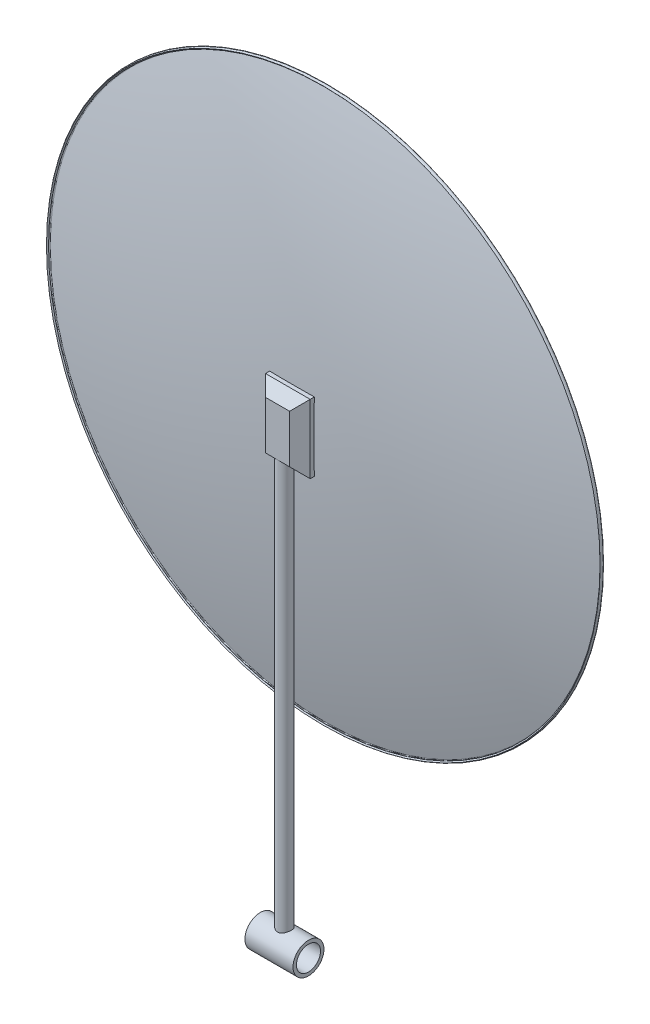
ISO-10303-21;
HEADER;
FILE_DESCRIPTION(('STEP AP214'),'2;1');
FILE_NAME('part.step','',(''),(''),'','','');
FILE_SCHEMA(('AUTOMOTIVE_DESIGN { 1 0 10303 214 1 1 1 1 }'));
ENDSEC;
DATA;
#1=APPLICATION_CONTEXT('core data for automotive mechanical design processes');
#2=APPLICATION_PROTOCOL_DEFINITION('international standard','automotive_design',2000,#1);
#3=PRODUCT_CONTEXT('',#1,'mechanical');
#4=PRODUCT('Part','Part','',(#3));
#5=PRODUCT_RELATED_PRODUCT_CATEGORY('part','',(#4));
#6=PRODUCT_DEFINITION_FORMATION('','',#4);
#7=PRODUCT_DEFINITION_CONTEXT('part definition',#1,'design');
#8=PRODUCT_DEFINITION('design','',#6,#7);
#9=PRODUCT_DEFINITION_SHAPE('','',#8);
#10=(LENGTH_UNIT() NAMED_UNIT(*) SI_UNIT(.MILLI.,.METRE.));
#11=(NAMED_UNIT(*) PLANE_ANGLE_UNIT() SI_UNIT($,.RADIAN.));
#12=(NAMED_UNIT(*) SI_UNIT($,.STERADIAN.) SOLID_ANGLE_UNIT());
#13=UNCERTAINTY_MEASURE_WITH_UNIT(LENGTH_MEASURE(1.E-05),#10,'distance_accuracy_value','');
#14=(GEOMETRIC_REPRESENTATION_CONTEXT(3) GLOBAL_UNCERTAINTY_ASSIGNED_CONTEXT((#13)) GLOBAL_UNIT_ASSIGNED_CONTEXT((#10,
#11,#12)) REPRESENTATION_CONTEXT('',''));
#15=CARTESIAN_POINT('',(0.,0.,0.));
#16=DIRECTION('',(0.,0.,1.));
#17=DIRECTION('',(1.,0.,0.));
#18=AXIS2_PLACEMENT_3D('',#15,#16,#17);
#19=CARTESIAN_POINT('',(35.,-650.,1637.));
#20=DIRECTION('',(-1.,0.,0.));
#21=DIRECTION('',(0.,0.,1.));
#22=AXIS2_PLACEMENT_3D('',#19,#20,#21);
#23=CYLINDRICAL_SURFACE('',#22,22.4999999999999);
#24=CARTESIAN_POINT('',(35.,-650.,1637.));
#25=DIRECTION('',(1.,0.,0.));
#26=DIRECTION('',(0.,0.,-1.));
#27=AXIS2_PLACEMENT_3D('',#24,#25,#26);
#28=CIRCLE('',#27,22.4999999999999);
#29=CARTESIAN_POINT('',(35.,-650.,1614.5));
#30=VERTEX_POINT('',#29);
#31=EDGE_CURVE('E12',#30,#30,#28,.T.);
#32=ORIENTED_EDGE('',*,*,#31,.F.);
#33=EDGE_LOOP('',(#32));
#34=FACE_BOUND('',#33,.T.);
#35=CARTESIAN_POINT('',(-35.,-650.,1637.));
#36=DIRECTION('',(1.,0.,0.));
#37=DIRECTION('',(0.,0.,-1.));
#38=AXIS2_PLACEMENT_3D('',#35,#36,#37);
#39=CIRCLE('',#38,22.4999999999999);
#40=CARTESIAN_POINT('',(-35.,-650.,1614.5));
#41=VERTEX_POINT('',#40);
#42=EDGE_CURVE('E46',#41,#41,#39,.T.);
#43=ORIENTED_EDGE('',*,*,#42,.T.);
#44=EDGE_LOOP('',(#43));
#45=FACE_BOUND('',#44,.T.);
#46=CARTESIAN_POINT('',(0.,-629.844355629254,1647.));
#47=CARTESIAN_POINT('',(-0.264893222766786,-629.844353266186,1646.99999788988));
#48=CARTESIAN_POINT('',(-0.529858910632883,-629.839115518338,1646.98945970578));
#49=CARTESIAN_POINT('',(-1.05782912167855,-629.818341760167,1646.94742186521));
#50=CARTESIAN_POINT('',(-1.32083238360988,-629.802799621743,1646.91590973534));
#51=CARTESIAN_POINT('',(-1.84329075499647,-629.761922773234,1646.83221232719));
#52=CARTESIAN_POINT('',(-2.10273785965919,-629.736568844321,1646.77998647092));
#53=CARTESIAN_POINT('',(-2.61580692820177,-629.676922745833,1646.655427986));
#54=CARTESIAN_POINT('',(-2.86942636769449,-629.642626779371,1646.58308681529));
#55=CARTESIAN_POINT('',(-3.36787435976666,-629.566394820367,1646.41944147543));
#56=CARTESIAN_POINT('',(-3.612740061546,-629.524497294152,1646.32823247179));
#57=CARTESIAN_POINT('',(-4.09362299113539,-629.434206046952,1646.1274433097));
#58=CARTESIAN_POINT('',(-4.32963678705899,-629.385809839061,1646.01785611429));
#59=CARTESIAN_POINT('',(-5.02217407233228,-629.232961068371,1645.66293925994));
#60=CARTESIAN_POINT('',(-5.46377159491158,-629.120754777156,1645.39126272339));
#61=CARTESIAN_POINT('',(-6.32515552311294,-628.879506304949,1644.76492214778));
#62=CARTESIAN_POINT('',(-6.74169992663891,-628.749845074449,1644.40603685697));
#63=CARTESIAN_POINT('',(-7.31849445200715,-628.557577028544,1643.8201900345));
#64=CARTESIAN_POINT('',(-7.50286899205392,-628.493814001776,1643.61682725277));
#65=CARTESIAN_POINT('',(-7.85457108124226,-628.368604174401,1643.19523871841));
#66=CARTESIAN_POINT('',(-8.02190489388817,-628.30715652802,1642.97701847636));
#67=CARTESIAN_POINT('',(-8.34655823456868,-628.185067983142,1642.51531001918));
#68=CARTESIAN_POINT('',(-8.50292843309705,-628.124628933583,1642.2711003579));
#69=CARTESIAN_POINT('',(-8.79433392314293,-628.009720666334,1641.76905477068));
#70=CARTESIAN_POINT('',(-8.92937808288005,-627.955248970082,1641.51122456854));
#71=CARTESIAN_POINT('',(-9.17692789686615,-627.853820780864,1640.98357877187));
#72=CARTESIAN_POINT('',(-9.28943715157123,-627.80686308761,1640.7137651004));
#73=CARTESIAN_POINT('',(-9.4907465385539,-627.721850676925,1640.164076172));
#74=CARTESIAN_POINT('',(-9.57954859082745,-627.683795238551,1639.88420173196));
#75=CARTESIAN_POINT('',(-9.72795131986179,-627.61967764754,1639.33314810454));
#76=CARTESIAN_POINT('',(-9.78895139332305,-627.593046119747,1639.0624117047));
#77=CARTESIAN_POINT('',(-9.88831107821199,-627.549461101742,1638.51604349653));
#78=CARTESIAN_POINT('',(-9.92667149487341,-627.532507267321,1638.24041186267));
#79=CARTESIAN_POINT('',(-9.98027933035644,-627.508770651393,1637.68658291075));
#80=CARTESIAN_POINT('',(-9.99553586948376,-627.501983856437,1637.40838664874));
#81=CARTESIAN_POINT('',(-10.0027737496438,-627.49876739847,1636.85163715474));
#82=CARTESIAN_POINT('',(-9.9947561458381,-627.502337265926,1636.57308393949));
#83=CARTESIAN_POINT('',(-9.95690917298989,-627.519124010819,1636.03716099116));
#84=CARTESIAN_POINT('',(-9.92862689765551,-627.531656518492,1635.77965874179));
#85=CARTESIAN_POINT('',(-9.85229236815466,-627.565283819603,1635.26818391145));
#86=CARTESIAN_POINT('',(-9.8042412071589,-627.586378139594,1635.0142111361));
#87=CARTESIAN_POINT('',(-9.68885278767565,-627.636610866924,1634.51149713066));
#88=CARTESIAN_POINT('',(-9.62151488194365,-627.665749544222,1634.26275607644));
#89=CARTESIAN_POINT('',(-9.46819259099748,-627.731370151891,1633.77208939092));
#90=CARTESIAN_POINT('',(-9.38220761059892,-627.767852316653,1633.53016397743));
#91=CARTESIAN_POINT('',(-9.19090546292428,-627.847910307968,1633.05097592972));
#92=CARTESIAN_POINT('',(-9.08531760941256,-627.891584348886,1632.81383770601));
#93=CARTESIAN_POINT('',(-8.85654234714597,-627.984608712838,1632.34932681145));
#94=CARTESIAN_POINT('',(-8.73334864963748,-628.033961062912,1632.12195766799));
#95=CARTESIAN_POINT('',(-8.33871167083957,-628.188871893507,1631.4563830872));
#96=CARTESIAN_POINT('',(-8.04209401987536,-628.301335469466,1631.03441591738));
#97=CARTESIAN_POINT('',(-7.36331076527228,-628.543989733526,1630.2111677291));
#98=CARTESIAN_POINT('',(-6.97625386257726,-628.67487897682,1629.81411891682));
#99=CARTESIAN_POINT('',(-6.35043917480369,-628.868537755327,1629.27028107768));
#100=CARTESIAN_POINT('',(-6.13414522209932,-628.932684476566,1629.09753169129));
#101=CARTESIAN_POINT('',(-5.68740074980601,-629.058400408055,1628.77016993501));
#102=CARTESIAN_POINT('',(-5.45694839985252,-629.11996928331,1628.61555991768));
#103=CARTESIAN_POINT('',(-4.97321313772538,-629.241248578339,1628.31950914949));
#104=CARTESIAN_POINT('',(-4.71937792604156,-629.300772469234,1628.17889374224));
#105=CARTESIAN_POINT('',(-4.19934554269097,-629.413108455593,1627.91981100518));
#106=CARTESIAN_POINT('',(-3.93315389547572,-629.465923511796,1627.80133389435));
#107=CARTESIAN_POINT('',(-3.39018441382009,-629.562973452533,1627.58768235873));
#108=CARTESIAN_POINT('',(-3.11341126085276,-629.607212080045,1627.49249776368));
#109=CARTESIAN_POINT('',(-2.55124522545489,-629.685438053987,1627.32647862188));
#110=CARTESIAN_POINT('',(-2.26585324435957,-629.719426468302,1627.25564153844));
#111=CARTESIAN_POINT('',(-1.70924022896528,-629.773772152647,1627.1433619682));
#112=CARTESIAN_POINT('',(-1.43844393322784,-629.794923286029,1627.10019529117));
#113=CARTESIAN_POINT('',(-0.893595718751954,-629.826389155497,1627.03623023032));
#114=CARTESIAN_POINT('',(-0.619543957450853,-629.836704413477,1627.01543076923));
#115=CARTESIAN_POINT('',(-0.0705692971284981,-629.846100045461,1626.99647918436));
#116=CARTESIAN_POINT('',(0.20435323751035,-629.845184622411,1626.99831858827));
#117=CARTESIAN_POINT('',(0.752841118051578,-629.832163913954,1627.02460006919));
#118=CARTESIAN_POINT('',(1.02640651702027,-629.820059069595,1627.04904125531));
#119=CARTESIAN_POINT('',(1.54882312722352,-629.786483878642,1627.11743558923));
#120=CARTESIAN_POINT('',(1.79794574261846,-629.765812598722,1627.15972865015));
#121=CARTESIAN_POINT('',(2.29154968826363,-629.7159942914,1627.26283466557));
#122=CARTESIAN_POINT('',(2.53602940762284,-629.6868443775,1627.32365392751));
#123=CARTESIAN_POINT('',(3.01871006088106,-629.620955748726,1627.4632029294));
#124=CARTESIAN_POINT('',(3.25691215759689,-629.584218450578,1627.54192932598));
#125=CARTESIAN_POINT('',(3.72585488903864,-629.504181292102,1627.71664691841));
#126=CARTESIAN_POINT('',(3.95659255086323,-629.460878855153,1627.81264489562));
#127=CARTESIAN_POINT('',(4.41939143687032,-629.366836647405,1628.02577438489));
#128=CARTESIAN_POINT('',(4.65105838996593,-629.315852367397,1628.14365377332));
#129=CARTESIAN_POINT('',(5.10383339590104,-629.209361150522,1628.39661867253));
#130=CARTESIAN_POINT('',(5.32493678040734,-629.153852242892,1628.53171169553));
#131=CARTESIAN_POINT('',(5.75549590915846,-629.039736901942,1628.81824291672));
#132=CARTESIAN_POINT('',(5.96494955534928,-628.981129914358,1628.96968404476));
#133=CARTESIAN_POINT('',(6.37123083359805,-628.862241347212,1629.28805902009));
#134=CARTESIAN_POINT('',(6.56805780235373,-628.801959679913,1629.45499368016));
#135=CARTESIAN_POINT('',(6.96630868570404,-628.675354841734,1629.82014549249));
#136=CARTESIAN_POINT('',(7.16638306915841,-628.609003402374,1630.01982775033));
#137=CARTESIAN_POINT('',(7.54906771567498,-628.477776119518,1630.43559738717));
#138=CARTESIAN_POINT('',(7.73168365067527,-628.412899802038,1630.65167939698));
#139=CARTESIAN_POINT('',(8.07845764824557,-628.286285333699,1631.09926218497));
#140=CARTESIAN_POINT('',(8.24260510455657,-628.224548997137,1631.33077170272));
#141=CARTESIAN_POINT('',(8.55105645817766,-628.105929953454,1631.80769381382));
#142=CARTESIAN_POINT('',(8.69536894743247,-628.049045148866,1632.05310032192));
#143=CARTESIAN_POINT('',(8.96422211083728,-627.94117008607,1632.5586703516));
#144=CARTESIAN_POINT('',(9.08857626936115,-627.890236521722,1632.81894536014));
#145=CARTESIAN_POINT('',(9.31475432231985,-627.79630528704,1633.35051039741));
#146=CARTESIAN_POINT('',(9.41657782680626,-627.753307754062,1633.62180061669));
#147=CARTESIAN_POINT('',(9.59653508100621,-627.676540096851,1634.17323865695));
#148=CARTESIAN_POINT('',(9.67468215003361,-627.642764785665,1634.45338139957));
#149=CARTESIAN_POINT('',(9.80642089323772,-627.585443025676,1635.02040338006));
#150=CARTESIAN_POINT('',(9.86001473466411,-627.561895674087,1635.30728202102));
#151=CARTESIAN_POINT('',(9.93878279058353,-627.527166088272,1635.86285450006));
#152=CARTESIAN_POINT('',(9.96583978011225,-627.515166056237,1636.13123177944));
#153=CARTESIAN_POINT('',(9.99817456596777,-627.50081601727,1636.66954714388));
#154=CARTESIAN_POINT('',(10.0034535482587,-627.498465484855,1636.93948514316));
#155=CARTESIAN_POINT('',(9.99217279985496,-627.503478189862,1637.47875754678));
#156=CARTESIAN_POINT('',(9.97561733071397,-627.510839531762,1637.74809205864));
#157=CARTESIAN_POINT('',(9.92086803636466,-627.535071333183,1638.28411610926));
#158=CARTESIAN_POINT('',(9.88267446227063,-627.55194168235,1638.55080567868));
#159=CARTESIAN_POINT('',(9.78726399042329,-627.593777874414,1639.06771118811));
#160=CARTESIAN_POINT('',(9.73097274942942,-627.618348568282,1639.3181309575));
#161=CARTESIAN_POINT('',(9.59956436386007,-627.675167952371,1639.81317832182));
#162=CARTESIAN_POINT('',(9.52444067518681,-627.707419311355,1640.05780387091));
#163=CARTESIAN_POINT('',(9.35607851748666,-627.778829948085,1640.53961949148));
#164=CARTESIAN_POINT('',(9.26284462261198,-627.817987481288,1640.77681142295));
#165=CARTESIAN_POINT('',(9.05898188158795,-627.902340812026,1641.24258216784));
#166=CARTESIAN_POINT('',(8.9483463993154,-627.94753891215,1641.47115765397));
#167=CARTESIAN_POINT('',(8.70511554092625,-628.045135630289,1641.92859841085));
#168=CARTESIAN_POINT('',(8.57175050921727,-628.097768176771,1642.15700447949));
#169=CARTESIAN_POINT('',(8.28784609439086,-628.207312237103,1642.6018989208));
#170=CARTESIAN_POINT('',(8.13730081312718,-628.264225218167,1642.81838316254));
#171=CARTESIAN_POINT('',(7.8200011252835,-628.381011661907,1643.23833757112));
#172=CARTESIAN_POINT('',(7.65324375035968,-628.44088566574,1643.44180534337));
#173=CARTESIAN_POINT('',(7.30448442404323,-628.562211746507,1643.834729139));
#174=CARTESIAN_POINT('',(7.12248166711394,-628.623663906709,1644.024184421));
#175=CARTESIAN_POINT('',(6.72920276426877,-628.751590202538,1644.40257086716));
#176=CARTESIAN_POINT('',(6.51674987514806,-628.818077323461,1644.59027675571));
#177=CARTESIAN_POINT('',(6.07643847757876,-628.949371334233,1644.94714925759));
#178=CARTESIAN_POINT('',(5.84858484088822,-629.014178746536,1645.1163216897));
#179=CARTESIAN_POINT('',(5.37838830215551,-629.140332536944,1645.43526657623));
#180=CARTESIAN_POINT('',(5.13603019128479,-629.201675146237,1645.5850181267));
#181=CARTESIAN_POINT('',(4.63851074083987,-629.318912485554,1645.86371677266));
#182=CARTESIAN_POINT('',(4.383355244408,-629.374809668207,1645.99267325159));
#183=CARTESIAN_POINT('',(3.86051776752749,-629.479577672107,1646.22925198455));
#184=CARTESIAN_POINT('',(3.59278525608953,-629.52841623584,1646.33677709633));
#185=CARTESIAN_POINT('',(3.04779572018049,-629.61699631455,1646.5286061316));
#186=CARTESIAN_POINT('',(2.7705435449444,-629.656742384362,1646.6129216861));
#187=CARTESIAN_POINT('',(2.20926578372365,-629.72554595679,1646.75719704322));
#188=CARTESIAN_POINT('',(1.92526008754448,-629.754631496429,1646.81722077692));
#189=CARTESIAN_POINT('',(1.35231205774493,-629.801055194436,1646.91238948186));
#190=CARTESIAN_POINT('',(1.06337360113138,-629.818402179223,1646.94755314669));
#191=CARTESIAN_POINT('',(0.644739380036075,-629.834457097055,1646.98002857488));
#192=CARTESIAN_POINT('',(0.515942344745803,-629.838165289659,1646.98751472603));
#193=CARTESIAN_POINT('',(0.25810261127328,-629.843115165208,1646.99750102093));
#194=CARTESIAN_POINT('',(0.129059906457335,-629.844356780575,1647.00000102808));
#195=CARTESIAN_POINT('',(0.,-629.844355629254,1647.));
#196=B_SPLINE_CURVE_WITH_KNOTS('',3,(#46,#47,#48,#49,#50,#51,#52,#53,#54,#55,#56,#57,#58,#59,
#60,#61,#62,#63,#64,#65,#66,#67,#68,#69,#70,#71,#72,#73,#74,#75,#76,#77,#78,#79,#80,#81,#82,#83,
#84,#85,#86,#87,#88,#89,#90,#91,#92,#93,#94,#95,#96,#97,#98,#99,#100,#101,#102,#103,#104,#105,
#106,#107,#108,#109,#110,#111,#112,#113,#114,#115,#116,#117,#118,#119,#120,#121,#122,#123,#124,
#125,#126,#127,#128,#129,#130,#131,#132,#133,#134,#135,#136,#137,#138,#139,#140,#141,#142,#143,
#144,#145,#146,#147,#148,#149,#150,#151,#152,#153,#154,#155,#156,#157,#158,#159,#160,#161,#162,
#163,#164,#165,#166,#167,#168,#169,#170,#171,#172,#173,#174,#175,#176,#177,#178,#179,#180,#181,
#182,#183,#184,#185,#186,#187,#188,#189,#190,#191,#192,#193,#194,#195),.UNSPECIFIED.,.T.,.F.,(4,
2,2,2,2,2,2,2,2,2,2,2,2,2,2,2,2,2,2,2,2,2,2,2,2,2,2,2,2,2,2,2,2,2,2,2,2,2,2,2,2,2,2,2,2,2,2,2,2,
2,2,2,2,2,2,2,2,2,2,2,2,2,2,2,2,2,2,2,2,2,2,2,2,2,4),(0.,0.794545983661118,1.58956491441366,
2.3861490339793,3.18307194418872,3.97606927706702,4.76937094238583,6.35414685016731,
8.04110114663061,8.88577403161513,9.73013531874925,10.6176638867953,11.5048224075619,
12.3918390716066,13.2787838762478,14.1140769634438,14.9493403396453,15.7842739077912,
16.6191696238023,17.3963151015549,18.1734176108505,18.950546202011,19.727699601508,
20.5165126239904,21.3056081156,22.8828449625339,24.5840413585069,25.4357153849808,
26.287499746514,27.1750428438785,28.0621928803459,28.9489548653083,29.835624433903,
30.6596032289087,31.4835423364615,32.3071731042589,33.1307714087573,33.8905016124848,
34.6504907649216,35.410338139231,36.1704845067569,36.9643087194597,37.7584805601152,
38.552794966708,39.3471510659659,40.2172097801,41.0869848602163,41.9572569208193,
42.8271508081116,43.7047523008649,44.5823689814845,45.4594910331811,46.3365356486664,
47.1455154397357,47.9544511756426,48.7632290503415,49.5719975392128,50.3446501244675,
51.1175715722755,51.890298054108,52.6633199340977,53.4714833490809,54.279925053828,
55.0885150595095,55.8971478165153,56.7697018395638,57.6419811256008,58.5151916438938,
59.3880070306049,60.2646929065415,61.140938645009,62.0148630483927,62.8881296009236,
63.2752335817625,63.6623481679957),.UNSPECIFIED.);
#197=CARTESIAN_POINT('',(0.,-629.844355629254,1647.));
#198=VERTEX_POINT('',#197);
#199=EDGE_CURVE('E125',#198,#198,#196,.T.);
#200=ORIENTED_EDGE('',*,*,#199,.T.);
#201=EDGE_LOOP('',(#200));
#202=FACE_BOUND('',#201,.T.);
#203=ADVANCED_FACE('F43',(#34,#45,#202),#23,.T.);
#204=CARTESIAN_POINT('',(35.,-650.,1637.));
#205=DIRECTION('',(1.,0.,0.));
#206=DIRECTION('',(0.,0.,-1.));
#207=AXIS2_PLACEMENT_3D('',#204,#205,#206);
#208=PLANE('',#207);
#209=ORIENTED_EDGE('',*,*,#31,.T.);
#210=EDGE_LOOP('',(#209));
#211=FACE_BOUND('',#210,.T.);
#212=CARTESIAN_POINT('',(35.,-650.,1637.));
#213=DIRECTION('',(1.,0.,0.));
#214=DIRECTION('',(0.,0.,-1.));
#215=AXIS2_PLACEMENT_3D('',#212,#213,#214);
#216=CIRCLE('',#215,17.5);
#217=CARTESIAN_POINT('',(35.,-650.,1619.5));
#218=VERTEX_POINT('',#217);
#219=EDGE_CURVE('E143',#218,#218,#216,.T.);
#220=ORIENTED_EDGE('',*,*,#219,.F.);
#221=EDGE_LOOP('',(#220));
#222=FACE_BOUND('',#221,.T.);
#223=ADVANCED_FACE('F214',(#211,#222),#208,.T.);
#224=CARTESIAN_POINT('',(-35.,-650.,1637.));
#225=DIRECTION('',(1.,0.,0.));
#226=DIRECTION('',(0.,0.,-1.));
#227=AXIS2_PLACEMENT_3D('',#224,#225,#226);
#228=PLANE('',#227);
#229=ORIENTED_EDGE('',*,*,#42,.F.);
#230=EDGE_LOOP('',(#229));
#231=FACE_BOUND('',#230,.T.);
#232=CARTESIAN_POINT('',(-35.,-650.,1637.));
#233=DIRECTION('',(1.,0.,0.));
#234=DIRECTION('',(0.,0.,-1.));
#235=AXIS2_PLACEMENT_3D('',#232,#233,#234);
#236=CIRCLE('',#235,17.5);
#237=CARTESIAN_POINT('',(-35.,-650.,1619.5));
#238=VERTEX_POINT('',#237);
#239=EDGE_CURVE('E142',#238,#238,#236,.T.);
#240=ORIENTED_EDGE('',*,*,#239,.T.);
#241=EDGE_LOOP('',(#240));
#242=FACE_BOUND('',#241,.T.);
#243=ADVANCED_FACE('F219',(#231,#242),#228,.F.);
#244=CARTESIAN_POINT('',(35.,-650.,1637.));
#245=DIRECTION('',(-1.,0.,0.));
#246=DIRECTION('',(0.,0.,1.));
#247=AXIS2_PLACEMENT_3D('',#244,#245,#246);
#248=CYLINDRICAL_SURFACE('',#247,17.5);
#249=ORIENTED_EDGE('',*,*,#219,.T.);
#250=EDGE_LOOP('',(#249));
#251=FACE_BOUND('',#250,.T.);
#252=ORIENTED_EDGE('',*,*,#239,.F.);
#253=EDGE_LOOP('',(#252));
#254=FACE_BOUND('',#253,.T.);
#255=ADVANCED_FACE('F230',(#251,#254),#248,.F.);
#256=CARTESIAN_POINT('',(0.,-672.501,1637.));
#257=DIRECTION('',(0.,1.,0.));
#258=DIRECTION('',(0.,0.,1.));
#259=AXIS2_PLACEMENT_3D('',#256,#257,#258);
#260=CYLINDRICAL_SURFACE('',#259,9.99999999999991);
#261=ORIENTED_EDGE('',*,*,#199,.F.);
#262=EDGE_LOOP('',(#261));
#263=FACE_BOUND('',#262,.T.);
#264=CARTESIAN_POINT('',(0.,-45.0000000000004,1637.));
#265=DIRECTION('',(0.,-0.707106781186548,0.707106781186548));
#266=DIRECTION('',(0.,0.707106781186548,0.707106781186548));
#267=AXIS2_PLACEMENT_3D('',#264,#265,#266);
#268=ELLIPSE('',#267,14.1421356237309,10.);
#269=CARTESIAN_POINT('',(0.,-35.0000000000004,1647.));
#270=VERTEX_POINT('',#269);
#271=CARTESIAN_POINT('',(-8.66025403784459,-50.,1632.));
#272=VERTEX_POINT('',#271);
#273=EDGE_CURVE('E122',#270,#272,#268,.T.);
#274=ORIENTED_EDGE('',*,*,#273,.T.);
#275=CARTESIAN_POINT('',(0.,-50.,1637.));
#276=DIRECTION('',(0.,-1.,0.));
#277=DIRECTION('',(0.,0.,-1.));
#278=AXIS2_PLACEMENT_3D('',#275,#276,#277);
#279=CIRCLE('',#278,10.);
#280=CARTESIAN_POINT('',(8.66025403784457,-50.,1632.));
#281=VERTEX_POINT('',#280);
#282=EDGE_CURVE('E57',#272,#281,#279,.T.);
#283=ORIENTED_EDGE('',*,*,#282,.T.);
#284=EDGE_CURVE('E65',#281,#270,#268,.T.);
#285=ORIENTED_EDGE('',*,*,#284,.T.);
#286=EDGE_LOOP('',(#274,#283,#285));
#287=FACE_BOUND('',#286,.T.);
#288=ADVANCED_FACE('F127',(#263,#287),#260,.T.);
#289=CARTESIAN_POINT('',(0.,-35.0000000000003,1647.));
#290=DIRECTION('',(0.,-0.707106781186548,0.707106781186548));
#291=DIRECTION('',(-1.,0.,0.));
#292=AXIS2_PLACEMENT_3D('',#289,#290,#291);
#293=PLANE('',#292);
#294=ORIENTED_EDGE('',*,*,#273,.F.);
#295=DIRECTION('',(1.,0.,0.));
#296=VECTOR('',#295,1.);
#297=CARTESIAN_POINT('',(32.5,-35.0000000000003,1647.));
#298=LINE('',#297,#296);
#299=CARTESIAN_POINT('',(-17.5000000000003,-35.0000000000003,1647.));
#300=VERTEX_POINT('',#299);
#301=EDGE_CURVE('E105',#300,#270,#298,.T.);
#302=ORIENTED_EDGE('',*,*,#301,.F.);
#303=DIRECTION('',(0.577350269189626,0.577350269189626,0.577350269189626));
#304=VECTOR('',#303,1.);
#305=CARTESIAN_POINT('',(-5.83333333333354,-23.3333333333336,1658.66666666667));
#306=LINE('',#305,#304);
#307=CARTESIAN_POINT('',(-32.5,-50.,1632.));
#308=VERTEX_POINT('',#307);
#309=EDGE_CURVE('E391',#300,#308,#306,.F.);
#310=ORIENTED_EDGE('',*,*,#309,.T.);
#311=DIRECTION('',(-1.,0.,0.));
#312=VECTOR('',#311,1.);
#313=CARTESIAN_POINT('',(-32.5,-50.,1632.));
#314=LINE('',#313,#312);
#315=EDGE_CURVE('E115',#272,#308,#314,.T.);
#316=ORIENTED_EDGE('',*,*,#315,.F.);
#317=EDGE_LOOP('',(#294,#302,#310,#316));
#318=FACE_BOUND('',#317,.T.);
#319=ADVANCED_FACE('F123',(#318),#293,.T.);
#320=CARTESIAN_POINT('',(0.,0.,1577.98199095485));
#321=DIRECTION('',(0.,0.,-1.));
#322=DIRECTION('',(-1.,0.,0.));
#323=AXIS2_PLACEMENT_3D('',#320,#321,#322);
#324=TOROIDAL_SURFACE('',#323,400.757331036155,1.07665733438018);
#325=CARTESIAN_POINT('',(0.,0.,1579.01797021422));
#326=DIRECTION('',(0.,0.,-1.));
#327=DIRECTION('',(-1.,0.,0.));
#328=AXIS2_PLACEMENT_3D('',#325,#326,#327);
#329=CIRCLE('',#328,401.050482856597);
#330=CARTESIAN_POINT('',(-401.050482856597,0.,1579.01797021422));
#331=VERTEX_POINT('',#330);
#332=EDGE_CURVE('E412',#331,#331,#329,.T.);
#333=ORIENTED_EDGE('',*,*,#332,.F.);
#334=EDGE_LOOP('',(#333));
#335=FACE_BOUND('',#334,.T.);
#336=CARTESIAN_POINT('',(0.,0.,1576.93846153845));
#337=DIRECTION('',(0.,0.,-1.));
#338=DIRECTION('',(-1.,0.,0.));
#339=AXIS2_PLACEMENT_3D('',#336,#337,#338);
#340=CIRCLE('',#339,400.492307692308);
#341=CARTESIAN_POINT('',(-400.492307692308,0.,1576.93846153845));
#342=VERTEX_POINT('',#341);
#343=EDGE_CURVE('E403',#342,#342,#340,.T.);
#344=ORIENTED_EDGE('',*,*,#343,.T.);
#345=EDGE_LOOP('',(#344));
#346=FACE_BOUND('',#345,.T.);
#347=ADVANCED_FACE('F175',(#335,#346),#324,.F.);
#348=CARTESIAN_POINT('',(0.,0.,0.));
#349=DIRECTION('',(0.,0.,-1.));
#350=DIRECTION('',(0.,1.,0.));
#351=AXIS2_PLACEMENT_3D('',#348,#349,#350);
#352=SPHERICAL_SURFACE('',#351,1626.99999999999);
#353=CARTESIAN_POINT('',(0.,50.,0.));
#354=DIRECTION('',(0.,1.,0.));
#355=DIRECTION('',(0.,0.,1.));
#356=AXIS2_PLACEMENT_3D('',#353,#354,#355);
#357=CIRCLE('',#356,1626.23153333096);
#358=CARTESIAN_POINT('',(-32.5,50.,1625.9067470184));
#359=VERTEX_POINT('',#358);
#360=CARTESIAN_POINT('',(32.5,50.,1625.9067470184));
#361=VERTEX_POINT('',#360);
#362=EDGE_CURVE('E373',#359,#361,#357,.T.);
#363=ORIENTED_EDGE('',*,*,#362,.T.);
#364=CARTESIAN_POINT('',(32.5,0.,0.));
#365=DIRECTION('',(1.,0.,0.));
#366=DIRECTION('',(0.,0.,-1.));
#367=AXIS2_PLACEMENT_3D('',#364,#365,#366);
#368=CIRCLE('',#367,1626.67536712153);
#369=CARTESIAN_POINT('',(32.5,-50.,1625.9067470184));
#370=VERTEX_POINT('',#369);
#371=EDGE_CURVE('E415',#361,#370,#368,.T.);
#372=ORIENTED_EDGE('',*,*,#371,.T.);
#373=CARTESIAN_POINT('',(0.,-50.,0.));
#374=DIRECTION('',(0.,-1.,0.));
#375=DIRECTION('',(0.,0.,-1.));
#376=AXIS2_PLACEMENT_3D('',#373,#374,#375);
#377=CIRCLE('',#376,1626.23153333096);
#378=CARTESIAN_POINT('',(-32.5,-50.,1625.9067470184));
#379=VERTEX_POINT('',#378);
#380=EDGE_CURVE('E418',#370,#379,#377,.T.);
#381=ORIENTED_EDGE('',*,*,#380,.T.);
#382=CARTESIAN_POINT('',(-32.5,0.,0.));
#383=DIRECTION('',(-1.,0.,0.));
#384=DIRECTION('',(0.,0.,1.));
#385=AXIS2_PLACEMENT_3D('',#382,#383,#384);
#386=CIRCLE('',#385,1626.67536712153);
#387=EDGE_CURVE('E421',#379,#359,#386,.T.);
#388=ORIENTED_EDGE('',*,*,#387,.T.);
#389=EDGE_LOOP('',(#363,#372,#381,#388));
#390=FACE_BOUND('',#389,.T.);
#391=ORIENTED_EDGE('',*,*,#343,.F.);
#392=EDGE_LOOP('',(#391));
#393=FACE_BOUND('',#392,.T.);
#394=ADVANCED_FACE('F178',(#390,#393),#352,.T.);
#395=CARTESIAN_POINT('',(0.,0.,0.));
#396=DIRECTION('',(0.,0.,-1.));
#397=DIRECTION('',(0.,-1.,0.));
#398=AXIS2_PLACEMENT_3D('',#395,#396,#397);
#399=SPHERICAL_SURFACE('',#398,1624.99999999999);
#400=CARTESIAN_POINT('',(0.,0.,1574.99999999999));
#401=DIRECTION('',(0.,0.,-1.));
#402=DIRECTION('',(-1.,0.,0.));
#403=AXIS2_PLACEMENT_3D('',#400,#401,#402);
#404=CIRCLE('',#403,400.);
#405=CARTESIAN_POINT('',(-400.,0.,1574.99999999999));
#406=VERTEX_POINT('',#405);
#407=EDGE_CURVE('E406',#406,#406,#404,.T.);
#408=ORIENTED_EDGE('',*,*,#407,.T.);
#409=EDGE_LOOP('',(#408));
#410=FACE_BOUND('',#409,.T.);
#411=ADVANCED_FACE('F182',(#410),#399,.F.);
#412=CARTESIAN_POINT('',(0.,0.,1577.98199095485));
#413=DIRECTION('',(0.,0.,-1.));
#414=DIRECTION('',(-1.,0.,0.));
#415=AXIS2_PLACEMENT_3D('',#412,#413,#414);
#416=TOROIDAL_SURFACE('',#415,400.757331036155,3.07665733438012);
#417=ORIENTED_EDGE('',*,*,#407,.F.);
#418=EDGE_LOOP('',(#417));
#419=FACE_BOUND('',#418,.T.);
#420=CARTESIAN_POINT('',(0.,0.,1580.41352053658));
#421=DIRECTION('',(0.,0.,-1.));
#422=DIRECTION('',(-1.,0.,0.));
#423=AXIS2_PLACEMENT_3D('',#420,#421,#422);
#424=CIRCLE('',#423,402.642399800517);
#425=CARTESIAN_POINT('',(-402.642399800517,0.,1580.41352053658));
#426=VERTEX_POINT('',#425);
#427=EDGE_CURVE('E409',#426,#426,#424,.T.);
#428=ORIENTED_EDGE('',*,*,#427,.T.);
#429=EDGE_LOOP('',(#428));
#430=FACE_BOUND('',#429,.T.);
#431=ADVANCED_FACE('F186',(#419,#430),#416,.T.);
#432=CARTESIAN_POINT('',(0.,0.,1579.01797021422));
#433=DIRECTION('',(0.,0.,1.));
#434=DIRECTION('',(1.,0.,0.));
#435=AXIS2_PLACEMENT_3D('',#432,#433,#434);
#436=CONICAL_SURFACE('',#435,401.050482856597,0.851033880042779);
#437=ORIENTED_EDGE('',*,*,#427,.F.);
#438=EDGE_LOOP('',(#437));
#439=FACE_BOUND('',#438,.T.);
#440=ORIENTED_EDGE('',*,*,#332,.T.);
#441=EDGE_LOOP('',(#440));
#442=FACE_BOUND('',#441,.T.);
#443=ADVANCED_FACE('F190',(#439,#442),#436,.F.);
#444=CARTESIAN_POINT('',(32.5,-50.,-1625.00099999999));
#445=DIRECTION('',(1.,0.,0.));
#446=DIRECTION('',(0.,0.,-1.));
#447=AXIS2_PLACEMENT_3D('',#444,#445,#446);
#448=PLANE('',#447);
#449=DIRECTION('',(0.,0.,1.));
#450=VECTOR('',#449,1.);
#451=CARTESIAN_POINT('',(32.5,50.,-1625.00099999999));
#452=LINE('',#451,#450);
#453=CARTESIAN_POINT('',(32.5,50.,1632.));
#454=VERTEX_POINT('',#453);
#455=EDGE_CURVE('E388',#361,#454,#452,.T.);
#456=ORIENTED_EDGE('',*,*,#455,.T.);
#457=DIRECTION('',(0.,-1.,0.));
#458=VECTOR('',#457,1.);
#459=CARTESIAN_POINT('',(32.5,-50.,1632.));
#460=LINE('',#459,#458);
#461=CARTESIAN_POINT('',(32.5,-50.,1632.));
#462=VERTEX_POINT('',#461);
#463=EDGE_CURVE('E128',#454,#462,#460,.T.);
#464=ORIENTED_EDGE('',*,*,#463,.T.);
#465=DIRECTION('',(0.,0.,1.));
#466=VECTOR('',#465,1.);
#467=CARTESIAN_POINT('',(32.5,-50.,-1625.00099999999));
#468=LINE('',#467,#466);
#469=EDGE_CURVE('E389',#370,#462,#468,.T.);
#470=ORIENTED_EDGE('',*,*,#469,.F.);
#471=ORIENTED_EDGE('',*,*,#371,.F.);
#472=EDGE_LOOP('',(#456,#464,#470,#471));
#473=FACE_BOUND('',#472,.T.);
#474=ADVANCED_FACE('F194',(#473),#448,.T.);
#475=CARTESIAN_POINT('',(-32.5,-50.,-1625.00099999999));
#476=DIRECTION('',(0.,-1.,0.));
#477=DIRECTION('',(0.,0.,-1.));
#478=AXIS2_PLACEMENT_3D('',#475,#476,#477);
#479=PLANE('',#478);
#480=ORIENTED_EDGE('',*,*,#282,.F.);
#481=ORIENTED_EDGE('',*,*,#315,.T.);
#482=DIRECTION('',(0.,0.,1.));
#483=VECTOR('',#482,1.);
#484=CARTESIAN_POINT('',(-32.5,-50.,-1625.00099999999));
#485=LINE('',#484,#483);
#486=EDGE_CURVE('E375',#379,#308,#485,.T.);
#487=ORIENTED_EDGE('',*,*,#486,.F.);
#488=ORIENTED_EDGE('',*,*,#380,.F.);
#489=ORIENTED_EDGE('',*,*,#469,.T.);
#490=EDGE_CURVE('E396',#462,#281,#314,.T.);
#491=ORIENTED_EDGE('',*,*,#490,.T.);
#492=EDGE_LOOP('',(#480,#481,#487,#488,#489,#491));
#493=FACE_BOUND('',#492,.T.);
#494=ADVANCED_FACE('F198',(#493),#479,.T.);
#495=CARTESIAN_POINT('',(-32.5,-50.,-1625.00099999999));
#496=DIRECTION('',(-1.,0.,0.));
#497=DIRECTION('',(0.,0.,1.));
#498=AXIS2_PLACEMENT_3D('',#495,#496,#497);
#499=PLANE('',#498);
#500=ORIENTED_EDGE('',*,*,#486,.T.);
#501=DIRECTION('',(0.,1.,0.));
#502=VECTOR('',#501,1.);
#503=CARTESIAN_POINT('',(-32.5,50.,1632.));
#504=LINE('',#503,#502);
#505=CARTESIAN_POINT('',(-32.5,50.,1632.));
#506=VERTEX_POINT('',#505);
#507=EDGE_CURVE('E384',#308,#506,#504,.T.);
#508=ORIENTED_EDGE('',*,*,#507,.T.);
#509=DIRECTION('',(0.,0.,1.));
#510=VECTOR('',#509,1.);
#511=CARTESIAN_POINT('',(-32.5,50.,-1625.00099999999));
#512=LINE('',#511,#510);
#513=EDGE_CURVE('E369',#359,#506,#512,.T.);
#514=ORIENTED_EDGE('',*,*,#513,.F.);
#515=ORIENTED_EDGE('',*,*,#387,.F.);
#516=EDGE_LOOP('',(#500,#508,#514,#515));
#517=FACE_BOUND('',#516,.T.);
#518=ADVANCED_FACE('F202',(#517),#499,.T.);
#519=CARTESIAN_POINT('',(-32.5,50.,-1625.00099999999));
#520=DIRECTION('',(0.,1.,0.));
#521=DIRECTION('',(0.,0.,1.));
#522=AXIS2_PLACEMENT_3D('',#519,#520,#521);
#523=PLANE('',#522);
#524=ORIENTED_EDGE('',*,*,#513,.T.);
#525=DIRECTION('',(1.,0.,0.));
#526=VECTOR('',#525,1.);
#527=CARTESIAN_POINT('',(32.5,50.,1632.));
#528=LINE('',#527,#526);
#529=EDGE_CURVE('E129',#506,#454,#528,.T.);
#530=ORIENTED_EDGE('',*,*,#529,.T.);
#531=ORIENTED_EDGE('',*,*,#455,.F.);
#532=ORIENTED_EDGE('',*,*,#362,.F.);
#533=EDGE_LOOP('',(#524,#530,#531,#532));
#534=FACE_BOUND('',#533,.T.);
#535=ADVANCED_FACE('F205',(#534),#523,.T.);
#536=CARTESIAN_POINT('',(0.,0.,1647.));
#537=DIRECTION('',(0.,0.,-1.));
#538=DIRECTION('',(-1.,0.,0.));
#539=AXIS2_PLACEMENT_3D('',#536,#537,#538);
#540=PLANE('',#539);
#541=DIRECTION('',(0.,-1.,0.));
#542=VECTOR('',#541,1.);
#543=CARTESIAN_POINT('',(-17.5000000000003,-50.,1647.));
#544=LINE('',#543,#542);
#545=CARTESIAN_POINT('',(-17.5000000000003,35.0000000000003,1647.));
#546=VERTEX_POINT('',#545);
#547=EDGE_CURVE('E110',#546,#300,#544,.T.);
#548=ORIENTED_EDGE('',*,*,#547,.T.);
#549=ORIENTED_EDGE('',*,*,#301,.T.);
#550=CARTESIAN_POINT('',(17.5000000000003,-35.0000000000003,1647.));
#551=VERTEX_POINT('',#550);
#552=EDGE_CURVE('E107',#270,#551,#298,.T.);
#553=ORIENTED_EDGE('',*,*,#552,.T.);
#554=DIRECTION('',(0.,1.,0.));
#555=VECTOR('',#554,1.);
#556=CARTESIAN_POINT('',(17.5000000000003,50.,1647.));
#557=LINE('',#556,#555);
#558=CARTESIAN_POINT('',(17.5000000000003,35.0000000000003,1647.));
#559=VERTEX_POINT('',#558);
#560=EDGE_CURVE('E401',#551,#559,#557,.T.);
#561=ORIENTED_EDGE('',*,*,#560,.T.);
#562=DIRECTION('',(-1.,0.,0.));
#563=VECTOR('',#562,1.);
#564=CARTESIAN_POINT('',(-32.5,35.0000000000003,1647.));
#565=LINE('',#564,#563);
#566=EDGE_CURVE('E399',#559,#546,#565,.T.);
#567=ORIENTED_EDGE('',*,*,#566,.T.);
#568=EDGE_LOOP('',(#548,#549,#553,#561,#567));
#569=FACE_BOUND('',#568,.T.);
#570=ADVANCED_FACE('F106',(#569),#540,.F.);
#571=CARTESIAN_POINT('',(0.,35.0000000000003,1647.));
#572=DIRECTION('',(0.,0.707106781186548,0.707106781186548));
#573=DIRECTION('',(1.,0.,0.));
#574=AXIS2_PLACEMENT_3D('',#571,#572,#573);
#575=PLANE('',#574);
#576=DIRECTION('',(-0.577350269189626,-0.577350269189626,0.577350269189626));
#577=VECTOR('',#576,1.);
#578=CARTESIAN_POINT('',(5.83333333333356,23.3333333333335,1658.66666666667));
#579=LINE('',#578,#577);
#580=EDGE_CURVE('E382',#454,#559,#579,.T.);
#581=ORIENTED_EDGE('',*,*,#580,.F.);
#582=ORIENTED_EDGE('',*,*,#529,.F.);
#583=DIRECTION('',(0.577350269189626,-0.577350269189626,0.577350269189626));
#584=VECTOR('',#583,1.);
#585=CARTESIAN_POINT('',(-11.6666666666669,29.1666666666669,1652.83333333333));
#586=LINE('',#585,#584);
#587=EDGE_CURVE('E133',#546,#506,#586,.F.);
#588=ORIENTED_EDGE('',*,*,#587,.F.);
#589=ORIENTED_EDGE('',*,*,#566,.F.);
#590=EDGE_LOOP('',(#581,#582,#588,#589));
#591=FACE_BOUND('',#590,.T.);
#592=ADVANCED_FACE('F150',(#591),#575,.T.);
#593=CARTESIAN_POINT('',(-17.5000000000003,0.,1647.));
#594=DIRECTION('',(-0.707106781186548,0.,0.707106781186548));
#595=DIRECTION('',(0.,1.,0.));
#596=AXIS2_PLACEMENT_3D('',#593,#594,#595);
#597=PLANE('',#596);
#598=ORIENTED_EDGE('',*,*,#587,.T.);
#599=ORIENTED_EDGE('',*,*,#507,.F.);
#600=ORIENTED_EDGE('',*,*,#309,.F.);
#601=ORIENTED_EDGE('',*,*,#547,.F.);
#602=EDGE_LOOP('',(#598,#599,#600,#601));
#603=FACE_BOUND('',#602,.T.);
#604=ADVANCED_FACE('F156',(#603),#597,.T.);
#605=CARTESIAN_POINT('',(17.5000000000003,0.,1647.));
#606=DIRECTION('',(0.707106781186548,0.,0.707106781186548));
#607=DIRECTION('',(0.,-1.,0.));
#608=AXIS2_PLACEMENT_3D('',#605,#606,#607);
#609=PLANE('',#608);
#610=ORIENTED_EDGE('',*,*,#580,.T.);
#611=ORIENTED_EDGE('',*,*,#560,.F.);
#612=DIRECTION('',(0.577350269189626,-0.577350269189626,-0.577350269189626));
#613=VECTOR('',#612,1.);
#614=CARTESIAN_POINT('',(5.83333333333355,-23.3333333333336,1658.66666666667));
#615=LINE('',#614,#613);
#616=EDGE_CURVE('E119',#462,#551,#615,.F.);
#617=ORIENTED_EDGE('',*,*,#616,.F.);
#618=ORIENTED_EDGE('',*,*,#463,.F.);
#619=EDGE_LOOP('',(#610,#611,#617,#618));
#620=FACE_BOUND('',#619,.T.);
#621=ADVANCED_FACE('F163',(#620),#609,.T.);
#622=ORIENTED_EDGE('',*,*,#284,.F.);
#623=ORIENTED_EDGE('',*,*,#490,.F.);
#624=ORIENTED_EDGE('',*,*,#616,.T.);
#625=ORIENTED_EDGE('',*,*,#552,.F.);
#626=EDGE_LOOP('',(#622,#623,#624,#625));
#627=FACE_BOUND('',#626,.T.);
#628=ADVANCED_FACE('F117',(#627),#293,.T.);
#629=CLOSED_SHELL('',(#203,#223,#243,#255,#288,#319,#347,#394,#411,#431,#443,#474,#494,#518,
#535,#570,#592,#604,#621,#628));
#630=MANIFOLD_SOLID_BREP('B2',#629);
#631=ADVANCED_BREP_SHAPE_REPRESENTATION('',(#18,#630),#14);
#632=SHAPE_DEFINITION_REPRESENTATION(#9,#631);
ENDSEC;
END-ISO-10303-21;
